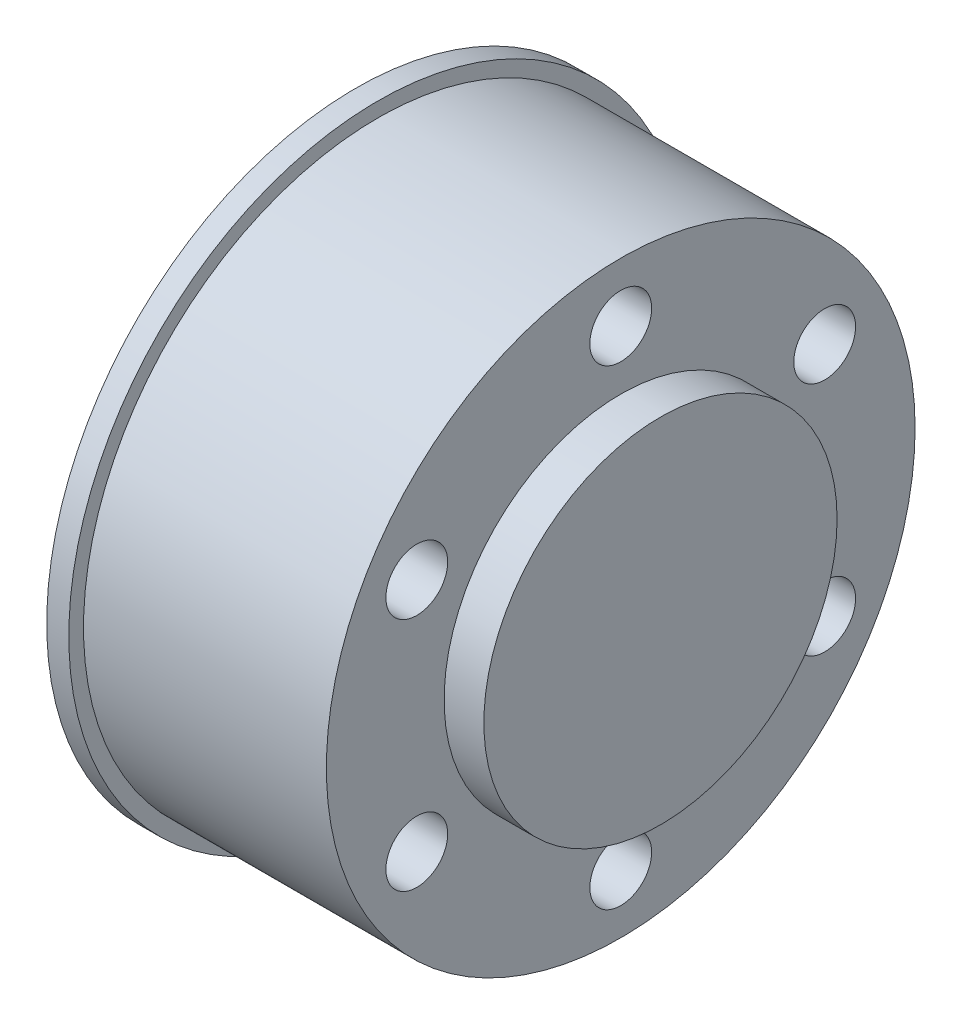
ISO-10303-21;
HEADER;
FILE_DESCRIPTION(('STEP AP214'),'2;1');
FILE_NAME('part.step','',(''),(''),'','','');
FILE_SCHEMA(('AUTOMOTIVE_DESIGN { 1 0 10303 214 1 1 1 1 }'));
ENDSEC;
DATA;
#1=APPLICATION_CONTEXT('core data for automotive mechanical design processes');
#2=APPLICATION_PROTOCOL_DEFINITION('international standard','automotive_design',2000,#1);
#3=PRODUCT_CONTEXT('',#1,'mechanical');
#4=PRODUCT('Part','Part','',(#3));
#5=PRODUCT_RELATED_PRODUCT_CATEGORY('part','',(#4));
#6=PRODUCT_DEFINITION_FORMATION('','',#4);
#7=PRODUCT_DEFINITION_CONTEXT('part definition',#1,'design');
#8=PRODUCT_DEFINITION('design','',#6,#7);
#9=PRODUCT_DEFINITION_SHAPE('','',#8);
#10=(LENGTH_UNIT() NAMED_UNIT(*) SI_UNIT(.MILLI.,.METRE.));
#11=(NAMED_UNIT(*) PLANE_ANGLE_UNIT() SI_UNIT($,.RADIAN.));
#12=(NAMED_UNIT(*) SI_UNIT($,.STERADIAN.) SOLID_ANGLE_UNIT());
#13=UNCERTAINTY_MEASURE_WITH_UNIT(LENGTH_MEASURE(1.E-05),#10,'distance_accuracy_value','');
#14=(GEOMETRIC_REPRESENTATION_CONTEXT(3) GLOBAL_UNCERTAINTY_ASSIGNED_CONTEXT((#13)) GLOBAL_UNIT_ASSIGNED_CONTEXT((#10,
#11,#12)) REPRESENTATION_CONTEXT('',''));
#15=CARTESIAN_POINT('',(0.,0.,0.));
#16=DIRECTION('',(0.,0.,1.));
#17=DIRECTION('',(1.,0.,0.));
#18=AXIS2_PLACEMENT_3D('',#15,#16,#17);
#19=CARTESIAN_POINT('',(0.,0.,0.));
#20=DIRECTION('',(1.,0.,0.));
#21=DIRECTION('',(0.,0.,-1.));
#22=AXIS2_PLACEMENT_3D('',#19,#20,#21);
#23=PLANE('',#22);
#24=CARTESIAN_POINT('',(0.,0.,0.));
#25=DIRECTION('',(1.,0.,0.));
#26=DIRECTION('',(0.,0.,-1.));
#27=AXIS2_PLACEMENT_3D('',#24,#25,#26);
#28=CIRCLE('',#27,12.);
#29=CARTESIAN_POINT('',(0.,0.,-12.));
#30=VERTEX_POINT('',#29);
#31=EDGE_CURVE('E10',#30,#30,#28,.T.);
#32=ORIENTED_EDGE('',*,*,#31,.T.);
#33=EDGE_LOOP('',(#32));
#34=FACE_BOUND('',#33,.T.);
#35=ADVANCED_FACE('F42',(#34),#23,.T.);
#36=CARTESIAN_POINT('',(0.,0.,0.));
#37=DIRECTION('',(1.,0.,0.));
#38=DIRECTION('',(0.,0.,-1.));
#39=AXIS2_PLACEMENT_3D('',#36,#37,#38);
#40=CYLINDRICAL_SURFACE('',#39,12.);
#41=CARTESIAN_POINT('',(-2.7,0.,0.));
#42=DIRECTION('',(1.,0.,0.));
#43=DIRECTION('',(0.,0.,-1.));
#44=AXIS2_PLACEMENT_3D('',#41,#42,#43);
#45=CIRCLE('',#44,12.);
#46=CARTESIAN_POINT('',(-2.7,0.,-12.));
#47=VERTEX_POINT('',#46);
#48=EDGE_CURVE('E49',#47,#47,#45,.T.);
#49=ORIENTED_EDGE('',*,*,#48,.T.);
#50=EDGE_LOOP('',(#49));
#51=FACE_BOUND('',#50,.T.);
#52=ORIENTED_EDGE('',*,*,#31,.F.);
#53=EDGE_LOOP('',(#52));
#54=FACE_BOUND('',#53,.T.);
#55=ADVANCED_FACE('F199',(#51,#54),#40,.T.);
#56=CARTESIAN_POINT('',(-2.7,0.,-12.));
#57=DIRECTION('',(1.,0.,0.));
#58=DIRECTION('',(0.,0.,-1.));
#59=AXIS2_PLACEMENT_3D('',#56,#57,#58);
#60=PLANE('',#59);
#61=CARTESIAN_POINT('',(-2.7,16.,0.));
#62=DIRECTION('',(1.,0.,0.));
#63=DIRECTION('',(0.,0.,-1.));
#64=AXIS2_PLACEMENT_3D('',#61,#62,#63);
#65=CIRCLE('',#64,2.1);
#66=CARTESIAN_POINT('',(-2.7,16.,-2.1));
#67=VERTEX_POINT('',#66);
#68=EDGE_CURVE('E171',#67,#67,#65,.T.);
#69=ORIENTED_EDGE('',*,*,#68,.F.);
#70=EDGE_LOOP('',(#69));
#71=FACE_BOUND('',#70,.T.);
#72=CARTESIAN_POINT('',(-2.7,8.00000000000016,13.8564064605509));
#73=DIRECTION('',(1.,0.,0.));
#74=DIRECTION('',(0.,0.,-1.));
#75=AXIS2_PLACEMENT_3D('',#72,#73,#74);
#76=CIRCLE('',#75,2.1);
#77=CARTESIAN_POINT('',(-2.7,8.00000000000016,11.7564064605509));
#78=VERTEX_POINT('',#77);
#79=EDGE_CURVE('E143',#78,#78,#76,.T.);
#80=ORIENTED_EDGE('',*,*,#79,.F.);
#81=EDGE_LOOP('',(#80));
#82=FACE_BOUND('',#81,.T.);
#83=CARTESIAN_POINT('',(-2.7,-7.99999999999987,13.8564064605511));
#84=DIRECTION('',(1.,0.,0.));
#85=DIRECTION('',(0.,0.,-1.));
#86=AXIS2_PLACEMENT_3D('',#83,#84,#85);
#87=CIRCLE('',#86,2.1);
#88=CARTESIAN_POINT('',(-2.7,-7.99999999999987,11.7564064605511));
#89=VERTEX_POINT('',#88);
#90=EDGE_CURVE('E142',#89,#89,#87,.T.);
#91=ORIENTED_EDGE('',*,*,#90,.F.);
#92=EDGE_LOOP('',(#91));
#93=FACE_BOUND('',#92,.T.);
#94=CARTESIAN_POINT('',(-2.7,-16.,1.1172740284298E-13));
#95=DIRECTION('',(1.,0.,0.));
#96=DIRECTION('',(0.,0.,-1.));
#97=AXIS2_PLACEMENT_3D('',#94,#95,#96);
#98=CIRCLE('',#97,2.1);
#99=CARTESIAN_POINT('',(-2.7,-16.,-2.09999999999989));
#100=VERTEX_POINT('',#99);
#101=EDGE_CURVE('E151',#100,#100,#98,.T.);
#102=ORIENTED_EDGE('',*,*,#101,.F.);
#103=EDGE_LOOP('',(#102));
#104=FACE_BOUND('',#103,.T.);
#105=CARTESIAN_POINT('',(-2.7,-8.00000000000007,-13.856406460551));
#106=DIRECTION('',(1.,0.,0.));
#107=DIRECTION('',(0.,0.,-1.));
#108=AXIS2_PLACEMENT_3D('',#105,#106,#107);
#109=CIRCLE('',#108,2.1);
#110=CARTESIAN_POINT('',(-2.7,-8.00000000000007,-15.956406460551));
#111=VERTEX_POINT('',#110);
#112=EDGE_CURVE('E159',#111,#111,#109,.T.);
#113=ORIENTED_EDGE('',*,*,#112,.F.);
#114=EDGE_LOOP('',(#113));
#115=FACE_BOUND('',#114,.T.);
#116=CARTESIAN_POINT('',(-2.7,7.99999999999997,-13.856406460551));
#117=DIRECTION('',(1.,0.,0.));
#118=DIRECTION('',(0.,0.,-1.));
#119=AXIS2_PLACEMENT_3D('',#116,#117,#118);
#120=CIRCLE('',#119,2.1);
#121=CARTESIAN_POINT('',(-2.7,7.99999999999997,-15.956406460551));
#122=VERTEX_POINT('',#121);
#123=EDGE_CURVE('E167',#122,#122,#120,.T.);
#124=ORIENTED_EDGE('',*,*,#123,.F.);
#125=EDGE_LOOP('',(#124));
#126=FACE_BOUND('',#125,.T.);
#127=CARTESIAN_POINT('',(-2.7,0.,0.));
#128=DIRECTION('',(1.,0.,0.));
#129=DIRECTION('',(0.,0.,-1.));
#130=AXIS2_PLACEMENT_3D('',#127,#128,#129);
#131=CIRCLE('',#130,20.);
#132=CARTESIAN_POINT('',(-2.7,0.,-20.));
#133=VERTEX_POINT('',#132);
#134=EDGE_CURVE('E54',#133,#133,#131,.T.);
#135=ORIENTED_EDGE('',*,*,#134,.T.);
#136=EDGE_LOOP('',(#135));
#137=FACE_BOUND('',#136,.T.);
#138=ORIENTED_EDGE('',*,*,#48,.F.);
#139=EDGE_LOOP('',(#138));
#140=FACE_BOUND('',#139,.T.);
#141=ADVANCED_FACE('F195',(#71,#82,#93,#104,#115,#126,#137,#140),#60,.T.);
#142=CARTESIAN_POINT('',(0.,0.,0.));
#143=DIRECTION('',(1.,0.,0.));
#144=DIRECTION('',(0.,0.,-1.));
#145=AXIS2_PLACEMENT_3D('',#142,#143,#144);
#146=CYLINDRICAL_SURFACE('',#145,20.);
#147=CARTESIAN_POINT('',(-19.2,0.,0.));
#148=DIRECTION('',(1.,0.,0.));
#149=DIRECTION('',(0.,0.,-1.));
#150=AXIS2_PLACEMENT_3D('',#147,#148,#149);
#151=CIRCLE('',#150,20.);
#152=CARTESIAN_POINT('',(-19.2,0.,-20.));
#153=VERTEX_POINT('',#152);
#154=EDGE_CURVE('E59',#153,#153,#151,.T.);
#155=ORIENTED_EDGE('',*,*,#154,.T.);
#156=EDGE_LOOP('',(#155));
#157=FACE_BOUND('',#156,.T.);
#158=ORIENTED_EDGE('',*,*,#134,.F.);
#159=EDGE_LOOP('',(#158));
#160=FACE_BOUND('',#159,.T.);
#161=ADVANCED_FACE('F198',(#157,#160),#146,.T.);
#162=CARTESIAN_POINT('',(-19.2,0.,-20.));
#163=DIRECTION('',(1.,0.,0.));
#164=DIRECTION('',(0.,0.,-1.));
#165=AXIS2_PLACEMENT_3D('',#162,#163,#164);
#166=PLANE('',#165);
#167=CARTESIAN_POINT('',(-19.2,0.,0.));
#168=DIRECTION('',(1.,0.,0.));
#169=DIRECTION('',(0.,0.,-1.));
#170=AXIS2_PLACEMENT_3D('',#167,#168,#169);
#171=CIRCLE('',#170,21.);
#172=CARTESIAN_POINT('',(-19.2,0.,-21.));
#173=VERTEX_POINT('',#172);
#174=EDGE_CURVE('E65',#173,#173,#171,.T.);
#175=ORIENTED_EDGE('',*,*,#174,.T.);
#176=EDGE_LOOP('',(#175));
#177=FACE_BOUND('',#176,.T.);
#178=ORIENTED_EDGE('',*,*,#154,.F.);
#179=EDGE_LOOP('',(#178));
#180=FACE_BOUND('',#179,.T.);
#181=ADVANCED_FACE('F215',(#177,#180),#166,.T.);
#182=CARTESIAN_POINT('',(0.,0.,0.));
#183=DIRECTION('',(1.,0.,0.));
#184=DIRECTION('',(0.,0.,-1.));
#185=AXIS2_PLACEMENT_3D('',#182,#183,#184);
#186=CYLINDRICAL_SURFACE('',#185,21.);
#187=CARTESIAN_POINT('',(-20.7,0.,0.));
#188=DIRECTION('',(1.,0.,0.));
#189=DIRECTION('',(0.,0.,-1.));
#190=AXIS2_PLACEMENT_3D('',#187,#188,#189);
#191=CIRCLE('',#190,21.);
#192=CARTESIAN_POINT('',(-20.7,0.,-21.));
#193=VERTEX_POINT('',#192);
#194=EDGE_CURVE('E69',#193,#193,#191,.T.);
#195=ORIENTED_EDGE('',*,*,#194,.T.);
#196=EDGE_LOOP('',(#195));
#197=FACE_BOUND('',#196,.T.);
#198=ORIENTED_EDGE('',*,*,#174,.F.);
#199=EDGE_LOOP('',(#198));
#200=FACE_BOUND('',#199,.T.);
#201=ADVANCED_FACE('F222',(#197,#200),#186,.T.);
#202=CARTESIAN_POINT('',(-20.7,0.,-14.5));
#203=DIRECTION('',(-1.,0.,0.));
#204=DIRECTION('',(0.,0.,1.));
#205=AXIS2_PLACEMENT_3D('',#202,#203,#204);
#206=PLANE('',#205);
#207=CARTESIAN_POINT('',(-20.7,16.,0.));
#208=DIRECTION('',(-1.,0.,0.));
#209=DIRECTION('',(0.,0.,1.));
#210=AXIS2_PLACEMENT_3D('',#207,#208,#209);
#211=CIRCLE('',#210,1.5);
#212=CARTESIAN_POINT('',(-20.7,16.,1.5));
#213=VERTEX_POINT('',#212);
#214=EDGE_CURVE('E123',#213,#213,#211,.T.);
#215=ORIENTED_EDGE('',*,*,#214,.F.);
#216=EDGE_LOOP('',(#215));
#217=FACE_BOUND('',#216,.T.);
#218=CARTESIAN_POINT('',(-20.7,8.04763509718006,-13.9389128690904));
#219=DIRECTION('',(-1.,0.,0.));
#220=DIRECTION('',(0.,0.,1.));
#221=AXIS2_PLACEMENT_3D('',#218,#219,#220);
#222=CIRCLE('',#221,1.5);
#223=CARTESIAN_POINT('',(-20.7,8.04763509718006,-12.4389128690904));
#224=VERTEX_POINT('',#223);
#225=EDGE_CURVE('E95',#224,#224,#222,.T.);
#226=ORIENTED_EDGE('',*,*,#225,.F.);
#227=EDGE_LOOP('',(#226));
#228=FACE_BOUND('',#227,.T.);
#229=CARTESIAN_POINT('',(-20.7,-8.00000000000001,-14.0214192776297));
#230=DIRECTION('',(-1.,0.,0.));
#231=DIRECTION('',(0.,0.,1.));
#232=AXIS2_PLACEMENT_3D('',#229,#230,#231);
#233=CIRCLE('',#232,1.5);
#234=CARTESIAN_POINT('',(-20.7,-8.00000000000001,-12.5214192776297));
#235=VERTEX_POINT('',#234);
#236=EDGE_CURVE('E94',#235,#235,#233,.T.);
#237=ORIENTED_EDGE('',*,*,#236,.F.);
#238=EDGE_LOOP('',(#237));
#239=FACE_BOUND('',#238,.T.);
#240=CARTESIAN_POINT('',(-20.7,-16.0952701943601,-0.165012817078659));
#241=DIRECTION('',(-1.,0.,0.));
#242=DIRECTION('',(0.,0.,1.));
#243=AXIS2_PLACEMENT_3D('',#240,#241,#242);
#244=CIRCLE('',#243,1.5);
#245=CARTESIAN_POINT('',(-20.7,-16.0952701943601,1.33498718292134));
#246=VERTEX_POINT('',#245);
#247=EDGE_CURVE('E103',#246,#246,#244,.T.);
#248=ORIENTED_EDGE('',*,*,#247,.F.);
#249=EDGE_LOOP('',(#248));
#250=FACE_BOUND('',#249,.T.);
#251=CARTESIAN_POINT('',(-20.7,-8.14290529154015,13.7739000520117));
#252=DIRECTION('',(-1.,0.,0.));
#253=DIRECTION('',(0.,0.,1.));
#254=AXIS2_PLACEMENT_3D('',#251,#252,#253);
#255=CIRCLE('',#254,1.5);
#256=CARTESIAN_POINT('',(-20.7,-8.14290529154015,15.2739000520117));
#257=VERTEX_POINT('',#256);
#258=EDGE_CURVE('E111',#257,#257,#255,.T.);
#259=ORIENTED_EDGE('',*,*,#258,.F.);
#260=EDGE_LOOP('',(#259));
#261=FACE_BOUND('',#260,.T.);
#262=CARTESIAN_POINT('',(-20.7,7.9047298056399,13.856406460551));
#263=DIRECTION('',(-1.,0.,0.));
#264=DIRECTION('',(0.,0.,1.));
#265=AXIS2_PLACEMENT_3D('',#262,#263,#264);
#266=CIRCLE('',#265,1.5);
#267=CARTESIAN_POINT('',(-20.7,7.9047298056399,15.356406460551));
#268=VERTEX_POINT('',#267);
#269=EDGE_CURVE('E119',#268,#268,#266,.T.);
#270=ORIENTED_EDGE('',*,*,#269,.F.);
#271=EDGE_LOOP('',(#270));
#272=FACE_BOUND('',#271,.T.);
#273=CARTESIAN_POINT('',(-20.7,0.,0.));
#274=DIRECTION('',(1.,0.,0.));
#275=DIRECTION('',(0.,0.,-1.));
#276=AXIS2_PLACEMENT_3D('',#273,#274,#275);
#277=CIRCLE('',#276,8.);
#278=CARTESIAN_POINT('',(-20.7,0.,-8.));
#279=VERTEX_POINT('',#278);
#280=EDGE_CURVE('E73',#279,#279,#277,.T.);
#281=ORIENTED_EDGE('',*,*,#280,.T.);
#282=EDGE_LOOP('',(#281));
#283=FACE_BOUND('',#282,.T.);
#284=ORIENTED_EDGE('',*,*,#194,.F.);
#285=EDGE_LOOP('',(#284));
#286=FACE_BOUND('',#285,.T.);
#287=ADVANCED_FACE('F262',(#217,#228,#239,#250,#261,#272,#283,#286),#206,.T.);
#288=CARTESIAN_POINT('',(0.,0.,0.));
#289=DIRECTION('',(1.,0.,0.));
#290=DIRECTION('',(0.,0.,-1.));
#291=AXIS2_PLACEMENT_3D('',#288,#289,#290);
#292=CYLINDRICAL_SURFACE('',#291,8.);
#293=CARTESIAN_POINT('',(-15.7,0.,0.));
#294=DIRECTION('',(1.,0.,0.));
#295=DIRECTION('',(0.,0.,-1.));
#296=AXIS2_PLACEMENT_3D('',#293,#294,#295);
#297=CIRCLE('',#296,8.);
#298=CARTESIAN_POINT('',(-15.7,0.,-8.));
#299=VERTEX_POINT('',#298);
#300=EDGE_CURVE('E77',#299,#299,#297,.T.);
#301=ORIENTED_EDGE('',*,*,#300,.T.);
#302=EDGE_LOOP('',(#301));
#303=FACE_BOUND('',#302,.T.);
#304=ORIENTED_EDGE('',*,*,#280,.F.);
#305=EDGE_LOOP('',(#304));
#306=FACE_BOUND('',#305,.T.);
#307=ADVANCED_FACE('F273',(#303,#306),#292,.F.);
#308=CARTESIAN_POINT('',(-15.7,0.,-8.));
#309=DIRECTION('',(-1.,0.,0.));
#310=DIRECTION('',(0.,0.,1.));
#311=AXIS2_PLACEMENT_3D('',#308,#309,#310);
#312=PLANE('',#311);
#313=CARTESIAN_POINT('',(-15.7,0.,0.));
#314=DIRECTION('',(1.,0.,0.));
#315=DIRECTION('',(0.,0.,-1.));
#316=AXIS2_PLACEMENT_3D('',#313,#314,#315);
#317=CIRCLE('',#316,6.);
#318=CARTESIAN_POINT('',(-15.7,0.,-6.));
#319=VERTEX_POINT('',#318);
#320=EDGE_CURVE('E81',#319,#319,#317,.T.);
#321=ORIENTED_EDGE('',*,*,#320,.T.);
#322=EDGE_LOOP('',(#321));
#323=FACE_BOUND('',#322,.T.);
#324=ORIENTED_EDGE('',*,*,#300,.F.);
#325=EDGE_LOOP('',(#324));
#326=FACE_BOUND('',#325,.T.);
#327=ADVANCED_FACE('F290',(#323,#326),#312,.T.);
#328=CARTESIAN_POINT('',(0.,0.,0.));
#329=DIRECTION('',(1.,0.,0.));
#330=DIRECTION('',(0.,0.,-1.));
#331=AXIS2_PLACEMENT_3D('',#328,#329,#330);
#332=CYLINDRICAL_SURFACE('',#331,6.);
#333=CARTESIAN_POINT('',(-14.7,0.,0.));
#334=DIRECTION('',(1.,0.,0.));
#335=DIRECTION('',(0.,0.,-1.));
#336=AXIS2_PLACEMENT_3D('',#333,#334,#335);
#337=CIRCLE('',#336,6.);
#338=CARTESIAN_POINT('',(-14.7,0.,-6.));
#339=VERTEX_POINT('',#338);
#340=EDGE_CURVE('E85',#339,#339,#337,.T.);
#341=ORIENTED_EDGE('',*,*,#340,.T.);
#342=EDGE_LOOP('',(#341));
#343=FACE_BOUND('',#342,.T.);
#344=ORIENTED_EDGE('',*,*,#320,.F.);
#345=EDGE_LOOP('',(#344));
#346=FACE_BOUND('',#345,.T.);
#347=ADVANCED_FACE('F300',(#343,#346),#332,.F.);
#348=CARTESIAN_POINT('',(-14.7,0.,-6.));
#349=DIRECTION('',(-1.,0.,0.));
#350=DIRECTION('',(0.,0.,1.));
#351=AXIS2_PLACEMENT_3D('',#348,#349,#350);
#352=PLANE('',#351);
#353=ORIENTED_EDGE('',*,*,#340,.F.);
#354=EDGE_LOOP('',(#353));
#355=FACE_BOUND('',#354,.T.);
#356=ADVANCED_FACE('F310',(#355),#352,.T.);
#357=CARTESIAN_POINT('',(-16.7,7.9047298056399,13.856406460551));
#358=DIRECTION('',(-1.,0.,0.));
#359=DIRECTION('',(0.,0.,1.));
#360=AXIS2_PLACEMENT_3D('',#357,#358,#359);
#361=CYLINDRICAL_SURFACE('',#360,1.5);
#362=CARTESIAN_POINT('',(-16.7,7.9047298056399,13.856406460551));
#363=DIRECTION('',(-1.,0.,0.));
#364=DIRECTION('',(0.,0.,1.));
#365=AXIS2_PLACEMENT_3D('',#362,#363,#364);
#366=CIRCLE('',#365,1.5);
#367=CARTESIAN_POINT('',(-16.7,7.9047298056399,15.356406460551));
#368=VERTEX_POINT('',#367);
#369=EDGE_CURVE('E115',#368,#368,#366,.T.);
#370=ORIENTED_EDGE('',*,*,#369,.F.);
#371=EDGE_LOOP('',(#370));
#372=FACE_BOUND('',#371,.T.);
#373=ORIENTED_EDGE('',*,*,#269,.T.);
#374=EDGE_LOOP('',(#373));
#375=FACE_BOUND('',#374,.T.);
#376=ADVANCED_FACE('F319',(#372,#375),#361,.F.);
#377=CARTESIAN_POINT('',(-16.7,7.9047298056399,13.856406460551));
#378=DIRECTION('',(-1.,0.,0.));
#379=DIRECTION('',(0.,0.,1.));
#380=AXIS2_PLACEMENT_3D('',#377,#378,#379);
#381=PLANE('',#380);
#382=ORIENTED_EDGE('',*,*,#369,.T.);
#383=EDGE_LOOP('',(#382));
#384=FACE_BOUND('',#383,.T.);
#385=ADVANCED_FACE('F328',(#384),#381,.T.);
#386=CARTESIAN_POINT('',(-16.7,-8.14290529154015,13.7739000520117));
#387=DIRECTION('',(-1.,0.,0.));
#388=DIRECTION('',(0.,0.,1.));
#389=AXIS2_PLACEMENT_3D('',#386,#387,#388);
#390=CYLINDRICAL_SURFACE('',#389,1.5);
#391=CARTESIAN_POINT('',(-16.7,-8.14290529154015,13.7739000520117));
#392=DIRECTION('',(-1.,0.,0.));
#393=DIRECTION('',(0.,0.,1.));
#394=AXIS2_PLACEMENT_3D('',#391,#392,#393);
#395=CIRCLE('',#394,1.5);
#396=CARTESIAN_POINT('',(-16.7,-8.14290529154015,15.2739000520117));
#397=VERTEX_POINT('',#396);
#398=EDGE_CURVE('E107',#397,#397,#395,.T.);
#399=ORIENTED_EDGE('',*,*,#398,.F.);
#400=EDGE_LOOP('',(#399));
#401=FACE_BOUND('',#400,.T.);
#402=ORIENTED_EDGE('',*,*,#258,.T.);
#403=EDGE_LOOP('',(#402));
#404=FACE_BOUND('',#403,.T.);
#405=ADVANCED_FACE('F338',(#401,#404),#390,.F.);
#406=CARTESIAN_POINT('',(-16.7,-8.14290529154015,13.7739000520117));
#407=DIRECTION('',(-1.,0.,0.));
#408=DIRECTION('',(0.,0.,1.));
#409=AXIS2_PLACEMENT_3D('',#406,#407,#408);
#410=PLANE('',#409);
#411=ORIENTED_EDGE('',*,*,#398,.T.);
#412=EDGE_LOOP('',(#411));
#413=FACE_BOUND('',#412,.T.);
#414=ADVANCED_FACE('F348',(#413),#410,.T.);
#415=CARTESIAN_POINT('',(-16.7,-16.0952701943601,-0.165012817078659));
#416=DIRECTION('',(-1.,0.,0.));
#417=DIRECTION('',(0.,0.,1.));
#418=AXIS2_PLACEMENT_3D('',#415,#416,#417);
#419=CYLINDRICAL_SURFACE('',#418,1.5);
#420=CARTESIAN_POINT('',(-16.7,-16.0952701943601,-0.165012817078659));
#421=DIRECTION('',(-1.,0.,0.));
#422=DIRECTION('',(0.,0.,1.));
#423=AXIS2_PLACEMENT_3D('',#420,#421,#422);
#424=CIRCLE('',#423,1.5);
#425=CARTESIAN_POINT('',(-16.7,-16.0952701943601,1.33498718292134));
#426=VERTEX_POINT('',#425);
#427=EDGE_CURVE('E99',#426,#426,#424,.T.);
#428=ORIENTED_EDGE('',*,*,#427,.F.);
#429=EDGE_LOOP('',(#428));
#430=FACE_BOUND('',#429,.T.);
#431=ORIENTED_EDGE('',*,*,#247,.T.);
#432=EDGE_LOOP('',(#431));
#433=FACE_BOUND('',#432,.T.);
#434=ADVANCED_FACE('F358',(#430,#433),#419,.F.);
#435=CARTESIAN_POINT('',(-16.7,-16.0952701943601,-0.165012817078659));
#436=DIRECTION('',(-1.,0.,0.));
#437=DIRECTION('',(0.,0.,1.));
#438=AXIS2_PLACEMENT_3D('',#435,#436,#437);
#439=PLANE('',#438);
#440=ORIENTED_EDGE('',*,*,#427,.T.);
#441=EDGE_LOOP('',(#440));
#442=FACE_BOUND('',#441,.T.);
#443=ADVANCED_FACE('F368',(#442),#439,.T.);
#444=CARTESIAN_POINT('',(-16.7,-8.00000000000001,-14.0214192776297));
#445=DIRECTION('',(-1.,0.,0.));
#446=DIRECTION('',(0.,0.,1.));
#447=AXIS2_PLACEMENT_3D('',#444,#445,#446);
#448=CYLINDRICAL_SURFACE('',#447,1.5);
#449=CARTESIAN_POINT('',(-16.7,-8.00000000000001,-14.0214192776297));
#450=DIRECTION('',(-1.,0.,0.));
#451=DIRECTION('',(0.,0.,1.));
#452=AXIS2_PLACEMENT_3D('',#449,#450,#451);
#453=CIRCLE('',#452,1.5);
#454=CARTESIAN_POINT('',(-16.7,-8.00000000000001,-12.5214192776297));
#455=VERTEX_POINT('',#454);
#456=EDGE_CURVE('E90',#455,#455,#453,.T.);
#457=ORIENTED_EDGE('',*,*,#456,.F.);
#458=EDGE_LOOP('',(#457));
#459=FACE_BOUND('',#458,.T.);
#460=ORIENTED_EDGE('',*,*,#236,.T.);
#461=EDGE_LOOP('',(#460));
#462=FACE_BOUND('',#461,.T.);
#463=ADVANCED_FACE('F378',(#459,#462),#448,.F.);
#464=CARTESIAN_POINT('',(-16.7,-8.00000000000001,-14.0214192776297));
#465=DIRECTION('',(-1.,0.,0.));
#466=DIRECTION('',(0.,0.,1.));
#467=AXIS2_PLACEMENT_3D('',#464,#465,#466);
#468=PLANE('',#467);
#469=ORIENTED_EDGE('',*,*,#456,.T.);
#470=EDGE_LOOP('',(#469));
#471=FACE_BOUND('',#470,.T.);
#472=ADVANCED_FACE('F388',(#471),#468,.T.);
#473=CARTESIAN_POINT('',(-16.7,8.04763509718006,-13.9389128690904));
#474=DIRECTION('',(-1.,0.,0.));
#475=DIRECTION('',(0.,0.,1.));
#476=AXIS2_PLACEMENT_3D('',#473,#474,#475);
#477=CYLINDRICAL_SURFACE('',#476,1.5);
#478=CARTESIAN_POINT('',(-16.7,8.04763509718006,-13.9389128690904));
#479=DIRECTION('',(-1.,0.,0.));
#480=DIRECTION('',(0.,0.,1.));
#481=AXIS2_PLACEMENT_3D('',#478,#479,#480);
#482=CIRCLE('',#481,1.5);
#483=CARTESIAN_POINT('',(-16.7,8.04763509718006,-12.4389128690904));
#484=VERTEX_POINT('',#483);
#485=EDGE_CURVE('E124',#484,#484,#482,.T.);
#486=ORIENTED_EDGE('',*,*,#485,.F.);
#487=EDGE_LOOP('',(#486));
#488=FACE_BOUND('',#487,.T.);
#489=ORIENTED_EDGE('',*,*,#225,.T.);
#490=EDGE_LOOP('',(#489));
#491=FACE_BOUND('',#490,.T.);
#492=ADVANCED_FACE('F398',(#488,#491),#477,.F.);
#493=CARTESIAN_POINT('',(-16.7,8.04763509718006,-13.9389128690904));
#494=DIRECTION('',(-1.,0.,0.));
#495=DIRECTION('',(0.,0.,1.));
#496=AXIS2_PLACEMENT_3D('',#493,#494,#495);
#497=PLANE('',#496);
#498=ORIENTED_EDGE('',*,*,#485,.T.);
#499=EDGE_LOOP('',(#498));
#500=FACE_BOUND('',#499,.T.);
#501=ADVANCED_FACE('F408',(#500),#497,.T.);
#502=CARTESIAN_POINT('',(-16.7,16.,0.));
#503=DIRECTION('',(-1.,0.,0.));
#504=DIRECTION('',(0.,0.,1.));
#505=AXIS2_PLACEMENT_3D('',#502,#503,#504);
#506=CYLINDRICAL_SURFACE('',#505,1.5);
#507=CARTESIAN_POINT('',(-16.7,16.,0.));
#508=DIRECTION('',(-1.,0.,0.));
#509=DIRECTION('',(0.,0.,1.));
#510=AXIS2_PLACEMENT_3D('',#507,#508,#509);
#511=CIRCLE('',#510,1.5);
#512=CARTESIAN_POINT('',(-16.7,16.,1.5));
#513=VERTEX_POINT('',#512);
#514=EDGE_CURVE('E89',#513,#513,#511,.T.);
#515=ORIENTED_EDGE('',*,*,#514,.F.);
#516=EDGE_LOOP('',(#515));
#517=FACE_BOUND('',#516,.T.);
#518=ORIENTED_EDGE('',*,*,#214,.T.);
#519=EDGE_LOOP('',(#518));
#520=FACE_BOUND('',#519,.T.);
#521=ADVANCED_FACE('F418',(#517,#520),#506,.F.);
#522=CARTESIAN_POINT('',(-16.7,16.,0.));
#523=DIRECTION('',(-1.,0.,0.));
#524=DIRECTION('',(0.,0.,1.));
#525=AXIS2_PLACEMENT_3D('',#522,#523,#524);
#526=PLANE('',#525);
#527=ORIENTED_EDGE('',*,*,#514,.T.);
#528=EDGE_LOOP('',(#527));
#529=FACE_BOUND('',#528,.T.);
#530=ADVANCED_FACE('F428',(#529),#526,.T.);
#531=CARTESIAN_POINT('',(-12.7,7.99999999999997,-13.856406460551));
#532=DIRECTION('',(1.,0.,0.));
#533=DIRECTION('',(0.,0.,-1.));
#534=AXIS2_PLACEMENT_3D('',#531,#532,#533);
#535=CYLINDRICAL_SURFACE('',#534,2.1);
#536=CARTESIAN_POINT('',(-12.7,7.99999999999997,-13.856406460551));
#537=DIRECTION('',(1.,0.,0.));
#538=DIRECTION('',(0.,0.,-1.));
#539=AXIS2_PLACEMENT_3D('',#536,#537,#538);
#540=CIRCLE('',#539,2.1);
#541=CARTESIAN_POINT('',(-12.7,7.99999999999997,-15.956406460551));
#542=VERTEX_POINT('',#541);
#543=EDGE_CURVE('E163',#542,#542,#540,.T.);
#544=ORIENTED_EDGE('',*,*,#543,.F.);
#545=EDGE_LOOP('',(#544));
#546=FACE_BOUND('',#545,.T.);
#547=ORIENTED_EDGE('',*,*,#123,.T.);
#548=EDGE_LOOP('',(#547));
#549=FACE_BOUND('',#548,.T.);
#550=ADVANCED_FACE('F437',(#546,#549),#535,.F.);
#551=CARTESIAN_POINT('',(-12.7,7.99999999999997,-13.856406460551));
#552=DIRECTION('',(1.,0.,0.));
#553=DIRECTION('',(0.,0.,-1.));
#554=AXIS2_PLACEMENT_3D('',#551,#552,#553);
#555=PLANE('',#554);
#556=ORIENTED_EDGE('',*,*,#543,.T.);
#557=EDGE_LOOP('',(#556));
#558=FACE_BOUND('',#557,.T.);
#559=ADVANCED_FACE('F446',(#558),#555,.T.);
#560=CARTESIAN_POINT('',(-12.7,-8.00000000000007,-13.856406460551));
#561=DIRECTION('',(1.,0.,0.));
#562=DIRECTION('',(0.,0.,-1.));
#563=AXIS2_PLACEMENT_3D('',#560,#561,#562);
#564=CYLINDRICAL_SURFACE('',#563,2.1);
#565=CARTESIAN_POINT('',(-12.7,-8.00000000000007,-13.856406460551));
#566=DIRECTION('',(1.,0.,0.));
#567=DIRECTION('',(0.,0.,-1.));
#568=AXIS2_PLACEMENT_3D('',#565,#566,#567);
#569=CIRCLE('',#568,2.1);
#570=CARTESIAN_POINT('',(-12.7,-8.00000000000007,-15.956406460551));
#571=VERTEX_POINT('',#570);
#572=EDGE_CURVE('E155',#571,#571,#569,.T.);
#573=ORIENTED_EDGE('',*,*,#572,.F.);
#574=EDGE_LOOP('',(#573));
#575=FACE_BOUND('',#574,.T.);
#576=ORIENTED_EDGE('',*,*,#112,.T.);
#577=EDGE_LOOP('',(#576));
#578=FACE_BOUND('',#577,.T.);
#579=ADVANCED_FACE('F456',(#575,#578),#564,.F.);
#580=CARTESIAN_POINT('',(-12.7,-8.00000000000007,-13.856406460551));
#581=DIRECTION('',(1.,0.,0.));
#582=DIRECTION('',(0.,0.,-1.));
#583=AXIS2_PLACEMENT_3D('',#580,#581,#582);
#584=PLANE('',#583);
#585=ORIENTED_EDGE('',*,*,#572,.T.);
#586=EDGE_LOOP('',(#585));
#587=FACE_BOUND('',#586,.T.);
#588=ADVANCED_FACE('F466',(#587),#584,.T.);
#589=CARTESIAN_POINT('',(-12.7,-16.,1.1172740284298E-13));
#590=DIRECTION('',(1.,0.,0.));
#591=DIRECTION('',(0.,0.,-1.));
#592=AXIS2_PLACEMENT_3D('',#589,#590,#591);
#593=CYLINDRICAL_SURFACE('',#592,2.1);
#594=CARTESIAN_POINT('',(-12.7,-16.,1.1172740284298E-13));
#595=DIRECTION('',(1.,0.,0.));
#596=DIRECTION('',(0.,0.,-1.));
#597=AXIS2_PLACEMENT_3D('',#594,#595,#596);
#598=CIRCLE('',#597,2.1);
#599=CARTESIAN_POINT('',(-12.7,-16.,-2.09999999999989));
#600=VERTEX_POINT('',#599);
#601=EDGE_CURVE('E147',#600,#600,#598,.T.);
#602=ORIENTED_EDGE('',*,*,#601,.F.);
#603=EDGE_LOOP('',(#602));
#604=FACE_BOUND('',#603,.T.);
#605=ORIENTED_EDGE('',*,*,#101,.T.);
#606=EDGE_LOOP('',(#605));
#607=FACE_BOUND('',#606,.T.);
#608=ADVANCED_FACE('F476',(#604,#607),#593,.F.);
#609=CARTESIAN_POINT('',(-12.7,-16.,1.1172740284298E-13));
#610=DIRECTION('',(1.,0.,0.));
#611=DIRECTION('',(0.,0.,-1.));
#612=AXIS2_PLACEMENT_3D('',#609,#610,#611);
#613=PLANE('',#612);
#614=ORIENTED_EDGE('',*,*,#601,.T.);
#615=EDGE_LOOP('',(#614));
#616=FACE_BOUND('',#615,.T.);
#617=ADVANCED_FACE('F486',(#616),#613,.T.);
#618=CARTESIAN_POINT('',(-12.7,-7.99999999999987,13.8564064605511));
#619=DIRECTION('',(1.,0.,0.));
#620=DIRECTION('',(0.,0.,-1.));
#621=AXIS2_PLACEMENT_3D('',#618,#619,#620);
#622=CYLINDRICAL_SURFACE('',#621,2.1);
#623=CARTESIAN_POINT('',(-12.7,-7.99999999999987,13.8564064605511));
#624=DIRECTION('',(1.,0.,0.));
#625=DIRECTION('',(0.,0.,-1.));
#626=AXIS2_PLACEMENT_3D('',#623,#624,#625);
#627=CIRCLE('',#626,2.1);
#628=CARTESIAN_POINT('',(-12.7,-7.99999999999987,11.7564064605511));
#629=VERTEX_POINT('',#628);
#630=EDGE_CURVE('E138',#629,#629,#627,.T.);
#631=ORIENTED_EDGE('',*,*,#630,.F.);
#632=EDGE_LOOP('',(#631));
#633=FACE_BOUND('',#632,.T.);
#634=ORIENTED_EDGE('',*,*,#90,.T.);
#635=EDGE_LOOP('',(#634));
#636=FACE_BOUND('',#635,.T.);
#637=ADVANCED_FACE('F496',(#633,#636),#622,.F.);
#638=CARTESIAN_POINT('',(-12.7,-7.99999999999987,13.8564064605511));
#639=DIRECTION('',(1.,0.,0.));
#640=DIRECTION('',(0.,0.,-1.));
#641=AXIS2_PLACEMENT_3D('',#638,#639,#640);
#642=PLANE('',#641);
#643=ORIENTED_EDGE('',*,*,#630,.T.);
#644=EDGE_LOOP('',(#643));
#645=FACE_BOUND('',#644,.T.);
#646=ADVANCED_FACE('F506',(#645),#642,.T.);
#647=CARTESIAN_POINT('',(-12.7,8.00000000000016,13.8564064605509));
#648=DIRECTION('',(1.,0.,0.));
#649=DIRECTION('',(0.,0.,-1.));
#650=AXIS2_PLACEMENT_3D('',#647,#648,#649);
#651=CYLINDRICAL_SURFACE('',#650,2.1);
#652=CARTESIAN_POINT('',(-12.7,8.00000000000016,13.8564064605509));
#653=DIRECTION('',(1.,0.,0.));
#654=DIRECTION('',(0.,0.,-1.));
#655=AXIS2_PLACEMENT_3D('',#652,#653,#654);
#656=CIRCLE('',#655,2.1);
#657=CARTESIAN_POINT('',(-12.7,8.00000000000016,11.7564064605509));
#658=VERTEX_POINT('',#657);
#659=EDGE_CURVE('E172',#658,#658,#656,.T.);
#660=ORIENTED_EDGE('',*,*,#659,.F.);
#661=EDGE_LOOP('',(#660));
#662=FACE_BOUND('',#661,.T.);
#663=ORIENTED_EDGE('',*,*,#79,.T.);
#664=EDGE_LOOP('',(#663));
#665=FACE_BOUND('',#664,.T.);
#666=ADVANCED_FACE('F516',(#662,#665),#651,.F.);
#667=CARTESIAN_POINT('',(-12.7,8.00000000000016,13.8564064605509));
#668=DIRECTION('',(1.,0.,0.));
#669=DIRECTION('',(0.,0.,-1.));
#670=AXIS2_PLACEMENT_3D('',#667,#668,#669);
#671=PLANE('',#670);
#672=ORIENTED_EDGE('',*,*,#659,.T.);
#673=EDGE_LOOP('',(#672));
#674=FACE_BOUND('',#673,.T.);
#675=ADVANCED_FACE('F191',(#674),#671,.T.);
#676=CARTESIAN_POINT('',(-12.7,16.,0.));
#677=DIRECTION('',(1.,0.,0.));
#678=DIRECTION('',(0.,0.,-1.));
#679=AXIS2_PLACEMENT_3D('',#676,#677,#678);
#680=CYLINDRICAL_SURFACE('',#679,2.1);
#681=CARTESIAN_POINT('',(-12.7,16.,0.));
#682=DIRECTION('',(1.,0.,0.));
#683=DIRECTION('',(0.,0.,-1.));
#684=AXIS2_PLACEMENT_3D('',#681,#682,#683);
#685=CIRCLE('',#684,2.1);
#686=CARTESIAN_POINT('',(-12.7,16.,-2.1));
#687=VERTEX_POINT('',#686);
#688=EDGE_CURVE('E128',#687,#687,#685,.T.);
#689=ORIENTED_EDGE('',*,*,#688,.F.);
#690=EDGE_LOOP('',(#689));
#691=FACE_BOUND('',#690,.T.);
#692=ORIENTED_EDGE('',*,*,#68,.T.);
#693=EDGE_LOOP('',(#692));
#694=FACE_BOUND('',#693,.T.);
#695=ADVANCED_FACE('F188',(#691,#694),#680,.F.);
#696=CARTESIAN_POINT('',(-12.7,16.,0.));
#697=DIRECTION('',(1.,0.,0.));
#698=DIRECTION('',(0.,0.,-1.));
#699=AXIS2_PLACEMENT_3D('',#696,#697,#698);
#700=PLANE('',#699);
#701=ORIENTED_EDGE('',*,*,#688,.T.);
#702=EDGE_LOOP('',(#701));
#703=FACE_BOUND('',#702,.T.);
#704=ADVANCED_FACE('F186',(#703),#700,.T.);
#705=CLOSED_SHELL('',(#35,#55,#141,#161,#181,#201,#287,#307,#327,#347,#356,#376,#385,#405,#414,
#434,#443,#463,#472,#492,#501,#521,#530,#550,#559,#579,#588,#608,#617,#637,#646,#666,#675,#695,#704));
#706=MANIFOLD_SOLID_BREP('B2',#705);
#707=ADVANCED_BREP_SHAPE_REPRESENTATION('',(#18,#706),#14);
#708=SHAPE_DEFINITION_REPRESENTATION(#9,#707);
ENDSEC;
END-ISO-10303-21;
